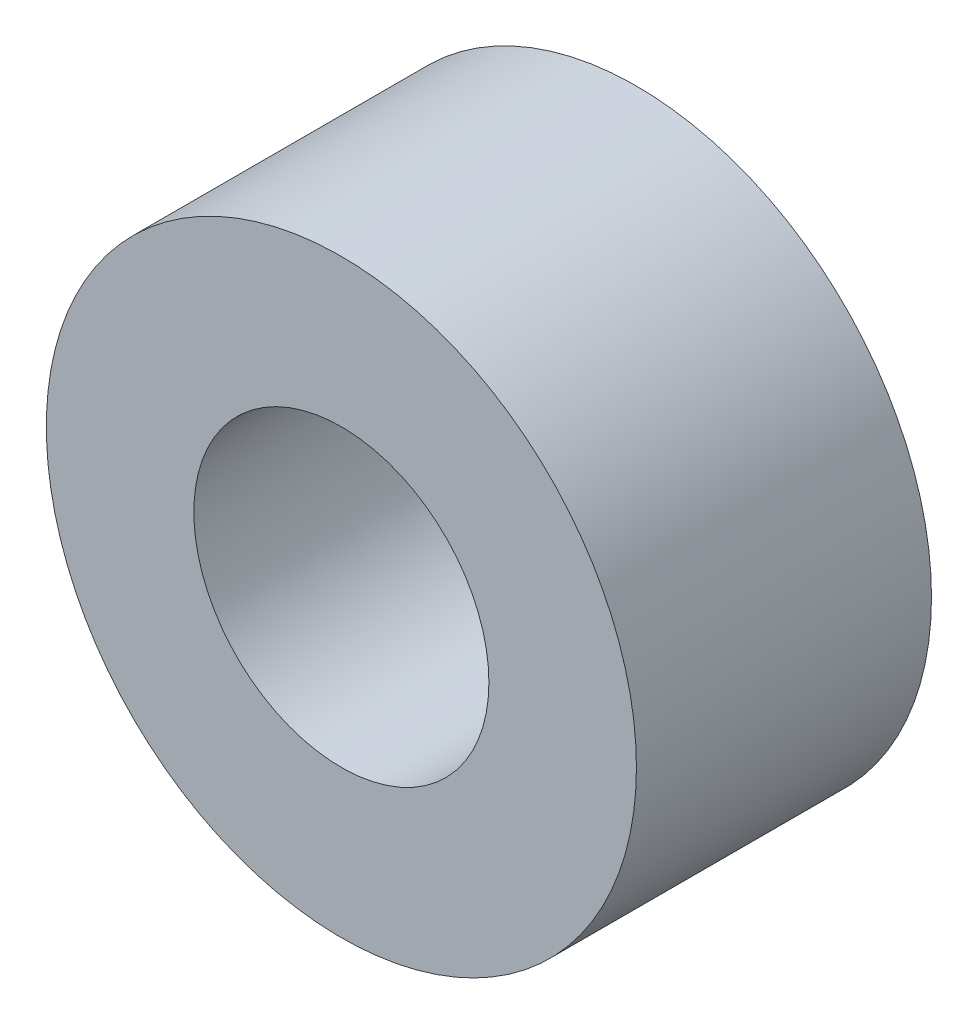
ISO-10303-21;
HEADER;
FILE_DESCRIPTION(('STEP AP214'),'2;1');
FILE_NAME('part.step','',(''),(''),'','','');
FILE_SCHEMA(('AUTOMOTIVE_DESIGN { 1 0 10303 214 1 1 1 1 }'));
ENDSEC;
DATA;
#1=APPLICATION_CONTEXT('core data for automotive mechanical design processes');
#2=APPLICATION_PROTOCOL_DEFINITION('international standard','automotive_design',2000,#1);
#3=PRODUCT_CONTEXT('',#1,'mechanical');
#4=PRODUCT('Part','Part','',(#3));
#5=PRODUCT_RELATED_PRODUCT_CATEGORY('part','',(#4));
#6=PRODUCT_DEFINITION_FORMATION('','',#4);
#7=PRODUCT_DEFINITION_CONTEXT('part definition',#1,'design');
#8=PRODUCT_DEFINITION('design','',#6,#7);
#9=PRODUCT_DEFINITION_SHAPE('','',#8);
#10=(LENGTH_UNIT() NAMED_UNIT(*) SI_UNIT(.MILLI.,.METRE.));
#11=(NAMED_UNIT(*) PLANE_ANGLE_UNIT() SI_UNIT($,.RADIAN.));
#12=(NAMED_UNIT(*) SI_UNIT($,.STERADIAN.) SOLID_ANGLE_UNIT());
#13=UNCERTAINTY_MEASURE_WITH_UNIT(LENGTH_MEASURE(1.E-05),#10,'distance_accuracy_value','');
#14=(GEOMETRIC_REPRESENTATION_CONTEXT(3) GLOBAL_UNCERTAINTY_ASSIGNED_CONTEXT((#13)) GLOBAL_UNIT_ASSIGNED_CONTEXT((#10,
#11,#12)) REPRESENTATION_CONTEXT('',''));
#15=CARTESIAN_POINT('',(0.,0.,0.));
#16=DIRECTION('',(0.,0.,1.));
#17=DIRECTION('',(1.,0.,0.));
#18=AXIS2_PLACEMENT_3D('',#15,#16,#17);
#19=CARTESIAN_POINT('',(0.,0.,5.));
#20=DIRECTION('',(0.,0.,-1.));
#21=DIRECTION('',(-1.,0.,0.));
#22=AXIS2_PLACEMENT_3D('',#19,#20,#21);
#23=CYLINDRICAL_SURFACE('',#22,10.);
#24=CARTESIAN_POINT('',(0.,0.,5.));
#25=DIRECTION('',(0.,0.,1.));
#26=DIRECTION('',(1.,0.,0.));
#27=AXIS2_PLACEMENT_3D('',#24,#25,#26);
#28=CIRCLE('',#27,10.);
#29=CARTESIAN_POINT('',(10.,0.,5.));
#30=VERTEX_POINT('',#29);
#31=EDGE_CURVE('E10',#30,#30,#28,.T.);
#32=ORIENTED_EDGE('',*,*,#31,.F.);
#33=EDGE_LOOP('',(#32));
#34=FACE_BOUND('',#33,.T.);
#35=CARTESIAN_POINT('',(0.,0.,-5.));
#36=DIRECTION('',(0.,0.,1.));
#37=DIRECTION('',(1.,0.,0.));
#38=AXIS2_PLACEMENT_3D('',#35,#36,#37);
#39=CIRCLE('',#38,10.);
#40=CARTESIAN_POINT('',(10.,0.,-5.));
#41=VERTEX_POINT('',#40);
#42=EDGE_CURVE('E46',#41,#41,#39,.T.);
#43=ORIENTED_EDGE('',*,*,#42,.T.);
#44=EDGE_LOOP('',(#43));
#45=FACE_BOUND('',#44,.T.);
#46=ADVANCED_FACE('F43',(#34,#45),#23,.T.);
#47=CARTESIAN_POINT('',(0.,0.,5.));
#48=DIRECTION('',(0.,0.,1.));
#49=DIRECTION('',(1.,0.,0.));
#50=AXIS2_PLACEMENT_3D('',#47,#48,#49);
#51=PLANE('',#50);
#52=CARTESIAN_POINT('',(0.,0.,5.));
#53=DIRECTION('',(0.,0.,1.));
#54=DIRECTION('',(1.,0.,0.));
#55=AXIS2_PLACEMENT_3D('',#52,#53,#54);
#56=CIRCLE('',#55,5.);
#57=CARTESIAN_POINT('',(5.,0.,5.));
#58=VERTEX_POINT('',#57);
#59=EDGE_CURVE('E60',#58,#58,#56,.T.);
#60=ORIENTED_EDGE('',*,*,#59,.F.);
#61=EDGE_LOOP('',(#60));
#62=FACE_BOUND('',#61,.T.);
#63=ORIENTED_EDGE('',*,*,#31,.T.);
#64=EDGE_LOOP('',(#63));
#65=FACE_BOUND('',#64,.T.);
#66=ADVANCED_FACE('F72',(#62,#65),#51,.T.);
#67=CARTESIAN_POINT('',(0.,0.,-5.));
#68=DIRECTION('',(0.,0.,1.));
#69=DIRECTION('',(1.,0.,0.));
#70=AXIS2_PLACEMENT_3D('',#67,#68,#69);
#71=PLANE('',#70);
#72=CARTESIAN_POINT('',(0.,0.,-5.));
#73=DIRECTION('',(0.,0.,1.));
#74=DIRECTION('',(1.,0.,0.));
#75=AXIS2_PLACEMENT_3D('',#72,#73,#74);
#76=CIRCLE('',#75,5.);
#77=CARTESIAN_POINT('',(5.,0.,-5.));
#78=VERTEX_POINT('',#77);
#79=EDGE_CURVE('E54',#78,#78,#76,.T.);
#80=ORIENTED_EDGE('',*,*,#79,.T.);
#81=EDGE_LOOP('',(#80));
#82=FACE_BOUND('',#81,.T.);
#83=ORIENTED_EDGE('',*,*,#42,.F.);
#84=EDGE_LOOP('',(#83));
#85=FACE_BOUND('',#84,.T.);
#86=ADVANCED_FACE('F64',(#82,#85),#71,.F.);
#87=CARTESIAN_POINT('',(0.,0.,-5.));
#88=DIRECTION('',(0.,0.,1.));
#89=DIRECTION('',(1.,0.,0.));
#90=AXIS2_PLACEMENT_3D('',#87,#88,#89);
#91=CYLINDRICAL_SURFACE('',#90,5.);
#92=ORIENTED_EDGE('',*,*,#79,.F.);
#93=EDGE_LOOP('',(#92));
#94=FACE_BOUND('',#93,.T.);
#95=ORIENTED_EDGE('',*,*,#59,.T.);
#96=EDGE_LOOP('',(#95));
#97=FACE_BOUND('',#96,.T.);
#98=ADVANCED_FACE('F66',(#94,#97),#91,.F.);
#99=CLOSED_SHELL('',(#46,#66,#86,#98));
#100=MANIFOLD_SOLID_BREP('B2',#99);
#101=ADVANCED_BREP_SHAPE_REPRESENTATION('',(#18,#100),#14);
#102=SHAPE_DEFINITION_REPRESENTATION(#9,#101);
ENDSEC;
END-ISO-10303-21;
